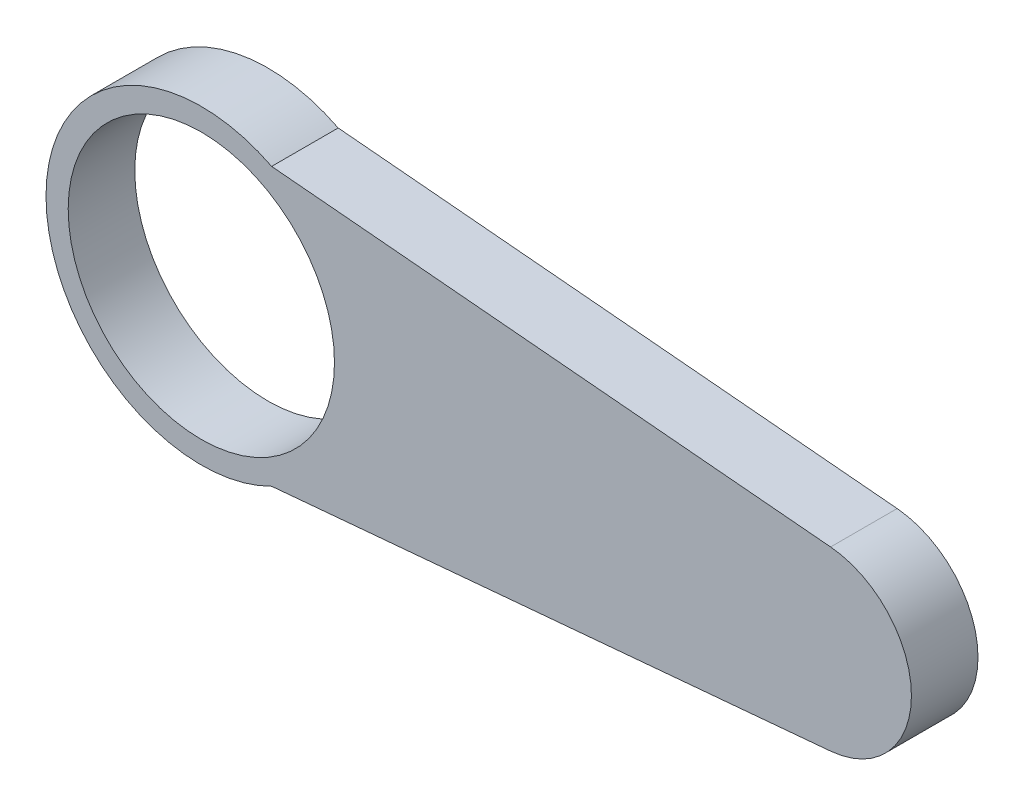
ISO-10303-21;
HEADER;
FILE_DESCRIPTION(('STEP AP214'),'2;1');
FILE_NAME('part.step','',(''),(''),'','','');
FILE_SCHEMA(('AUTOMOTIVE_DESIGN { 1 0 10303 214 1 1 1 1 }'));
ENDSEC;
DATA;
#1=APPLICATION_CONTEXT('core data for automotive mechanical design processes');
#2=APPLICATION_PROTOCOL_DEFINITION('international standard','automotive_design',2000,#1);
#3=PRODUCT_CONTEXT('',#1,'mechanical');
#4=PRODUCT('Part','Part','',(#3));
#5=PRODUCT_RELATED_PRODUCT_CATEGORY('part','',(#4));
#6=PRODUCT_DEFINITION_FORMATION('','',#4);
#7=PRODUCT_DEFINITION_CONTEXT('part definition',#1,'design');
#8=PRODUCT_DEFINITION('design','',#6,#7);
#9=PRODUCT_DEFINITION_SHAPE('','',#8);
#10=(LENGTH_UNIT() NAMED_UNIT(*) SI_UNIT(.MILLI.,.METRE.));
#11=(NAMED_UNIT(*) PLANE_ANGLE_UNIT() SI_UNIT($,.RADIAN.));
#12=(NAMED_UNIT(*) SI_UNIT($,.STERADIAN.) SOLID_ANGLE_UNIT());
#13=UNCERTAINTY_MEASURE_WITH_UNIT(LENGTH_MEASURE(1.E-05),#10,'distance_accuracy_value','');
#14=(GEOMETRIC_REPRESENTATION_CONTEXT(3) GLOBAL_UNCERTAINTY_ASSIGNED_CONTEXT((#13)) GLOBAL_UNIT_ASSIGNED_CONTEXT((#10,
#11,#12)) REPRESENTATION_CONTEXT('',''));
#15=CARTESIAN_POINT('',(0.,0.,0.));
#16=DIRECTION('',(0.,0.,1.));
#17=DIRECTION('',(1.,0.,0.));
#18=AXIS2_PLACEMENT_3D('',#15,#16,#17);
#19=CARTESIAN_POINT('',(0.,0.,1.5));
#20=DIRECTION('',(0.,0.,1.));
#21=DIRECTION('',(1.,0.,0.));
#22=AXIS2_PLACEMENT_3D('',#19,#20,#21);
#23=PLANE('',#22);
#24=CARTESIAN_POINT('',(0.,0.,1.5));
#25=DIRECTION('',(0.,0.,1.));
#26=DIRECTION('',(1.,0.,0.));
#27=AXIS2_PLACEMENT_3D('',#24,#25,#26);
#28=CIRCLE('',#27,3.5);
#29=CARTESIAN_POINT('',(1.58402839011555,3.12103413299309,1.5));
#30=VERTEX_POINT('',#29);
#31=CARTESIAN_POINT('',(1.58402839011555,-3.12103413299309,1.5));
#32=VERTEX_POINT('',#31);
#33=EDGE_CURVE('E85',#30,#32,#28,.T.);
#34=ORIENTED_EDGE('',*,*,#33,.T.);
#35=DIRECTION('',(0.996006054813167,0.0892857142857144,0.));
#36=VECTOR('',#35,1.);
#37=CARTESIAN_POINT('',(14.1785714285714,-1.99201210962634,1.5));
#38=LINE('',#37,#36);
#39=CARTESIAN_POINT('',(14.1785714285714,-1.99201210962634,1.5));
#40=VERTEX_POINT('',#39);
#41=EDGE_CURVE('E80',#32,#40,#38,.T.);
#42=ORIENTED_EDGE('',*,*,#41,.T.);
#43=CARTESIAN_POINT('',(14.,0.,1.5));
#44=DIRECTION('',(0.,0.,1.));
#45=DIRECTION('',(1.,0.,0.));
#46=AXIS2_PLACEMENT_3D('',#43,#44,#45);
#47=CIRCLE('',#46,2.);
#48=CARTESIAN_POINT('',(14.1785714285714,1.99201210962634,1.5));
#49=VERTEX_POINT('',#48);
#50=EDGE_CURVE('E83',#40,#49,#47,.T.);
#51=ORIENTED_EDGE('',*,*,#50,.T.);
#52=DIRECTION('',(-0.996006054813167,0.0892857142857142,0.));
#53=VECTOR('',#52,1.);
#54=CARTESIAN_POINT('',(1.58402839011555,3.12103413299309,1.5));
#55=LINE('',#54,#53);
#56=EDGE_CURVE('E50',#49,#30,#55,.T.);
#57=ORIENTED_EDGE('',*,*,#56,.T.);
#58=EDGE_LOOP('',(#34,#42,#51,#57));
#59=FACE_BOUND('',#58,.T.);
#60=CARTESIAN_POINT('',(0.,0.,1.5));
#61=DIRECTION('',(0.,0.,1.));
#62=DIRECTION('',(1.,0.,0.));
#63=AXIS2_PLACEMENT_3D('',#60,#61,#62);
#64=CIRCLE('',#63,3.);
#65=CARTESIAN_POINT('',(3.,0.,1.5));
#66=VERTEX_POINT('',#65);
#67=EDGE_CURVE('E100',#66,#66,#64,.T.);
#68=ORIENTED_EDGE('',*,*,#67,.F.);
#69=EDGE_LOOP('',(#68));
#70=FACE_BOUND('',#69,.T.);
#71=ADVANCED_FACE('F33',(#59,#70),#23,.T.);
#72=CARTESIAN_POINT('',(0.,0.,0.));
#73=DIRECTION('',(0.,0.,1.));
#74=DIRECTION('',(1.,0.,0.));
#75=AXIS2_PLACEMENT_3D('',#72,#73,#74);
#76=PLANE('',#75);
#77=CARTESIAN_POINT('',(0.,0.,0.));
#78=DIRECTION('',(0.,0.,1.));
#79=DIRECTION('',(1.,0.,0.));
#80=AXIS2_PLACEMENT_3D('',#77,#78,#79);
#81=CIRCLE('',#80,3.5);
#82=CARTESIAN_POINT('',(1.58402839011555,3.12103413299309,0.));
#83=VERTEX_POINT('',#82);
#84=CARTESIAN_POINT('',(1.58402839011555,-3.12103413299309,0.));
#85=VERTEX_POINT('',#84);
#86=EDGE_CURVE('E97',#83,#85,#81,.T.);
#87=ORIENTED_EDGE('',*,*,#86,.F.);
#88=DIRECTION('',(-0.996006054813167,0.0892857142857142,0.));
#89=VECTOR('',#88,1.);
#90=CARTESIAN_POINT('',(1.58402839011555,3.12103413299309,0.));
#91=LINE('',#90,#89);
#92=CARTESIAN_POINT('',(14.1785714285714,1.99201210962634,0.));
#93=VERTEX_POINT('',#92);
#94=EDGE_CURVE('E73',#93,#83,#91,.T.);
#95=ORIENTED_EDGE('',*,*,#94,.F.);
#96=CARTESIAN_POINT('',(14.,0.,0.));
#97=DIRECTION('',(0.,0.,1.));
#98=DIRECTION('',(1.,0.,0.));
#99=AXIS2_PLACEMENT_3D('',#96,#97,#98);
#100=CIRCLE('',#99,2.);
#101=CARTESIAN_POINT('',(14.1785714285714,-1.99201210962634,0.));
#102=VERTEX_POINT('',#101);
#103=EDGE_CURVE('E67',#102,#93,#100,.T.);
#104=ORIENTED_EDGE('',*,*,#103,.F.);
#105=DIRECTION('',(0.996006054813167,0.0892857142857144,0.));
#106=VECTOR('',#105,1.);
#107=CARTESIAN_POINT('',(14.1785714285714,-1.99201210962634,0.));
#108=LINE('',#107,#106);
#109=EDGE_CURVE('E89',#85,#102,#108,.T.);
#110=ORIENTED_EDGE('',*,*,#109,.F.);
#111=EDGE_LOOP('',(#87,#95,#104,#110));
#112=FACE_BOUND('',#111,.T.);
#113=CARTESIAN_POINT('',(0.,0.,0.));
#114=DIRECTION('',(0.,0.,1.));
#115=DIRECTION('',(1.,0.,0.));
#116=AXIS2_PLACEMENT_3D('',#113,#114,#115);
#117=CIRCLE('',#116,3.);
#118=CARTESIAN_POINT('',(3.,0.,0.));
#119=VERTEX_POINT('',#118);
#120=EDGE_CURVE('E112',#119,#119,#117,.T.);
#121=ORIENTED_EDGE('',*,*,#120,.T.);
#122=EDGE_LOOP('',(#121));
#123=FACE_BOUND('',#122,.T.);
#124=ADVANCED_FACE('F108',(#112,#123),#76,.F.);
#125=CARTESIAN_POINT('',(0.,0.,1.5));
#126=DIRECTION('',(0.,0.,-1.));
#127=DIRECTION('',(-1.,0.,0.));
#128=AXIS2_PLACEMENT_3D('',#125,#126,#127);
#129=CYLINDRICAL_SURFACE('',#128,3.5);
#130=ORIENTED_EDGE('',*,*,#86,.T.);
#131=DIRECTION('',(0.,0.,-1.));
#132=VECTOR('',#131,1.);
#133=CARTESIAN_POINT('',(1.58402839011555,-3.12103413299309,1.5));
#134=LINE('',#133,#132);
#135=EDGE_CURVE('E11',#32,#85,#134,.T.);
#136=ORIENTED_EDGE('',*,*,#135,.F.);
#137=ORIENTED_EDGE('',*,*,#33,.F.);
#138=DIRECTION('',(0.,0.,-1.));
#139=VECTOR('',#138,1.);
#140=CARTESIAN_POINT('',(1.58402839011555,3.12103413299309,1.5));
#141=LINE('',#140,#139);
#142=EDGE_CURVE('E93',#30,#83,#141,.T.);
#143=ORIENTED_EDGE('',*,*,#142,.T.);
#144=EDGE_LOOP('',(#130,#136,#137,#143));
#145=FACE_BOUND('',#144,.T.);
#146=ADVANCED_FACE('F35',(#145),#129,.T.);
#147=CARTESIAN_POINT('',(14.1785714285714,-1.99201210962634,1.5));
#148=DIRECTION('',(-0.0892857142857143,0.996006054813167,0.));
#149=DIRECTION('',(-0.996006054813167,-0.0892857142857144,0.));
#150=AXIS2_PLACEMENT_3D('',#147,#148,#149);
#151=PLANE('',#150);
#152=ORIENTED_EDGE('',*,*,#109,.T.);
#153=DIRECTION('',(0.,0.,-1.));
#154=VECTOR('',#153,1.);
#155=CARTESIAN_POINT('',(14.1785714285714,-1.99201210962634,1.5));
#156=LINE('',#155,#154);
#157=EDGE_CURVE('E42',#40,#102,#156,.T.);
#158=ORIENTED_EDGE('',*,*,#157,.F.);
#159=ORIENTED_EDGE('',*,*,#41,.F.);
#160=ORIENTED_EDGE('',*,*,#135,.T.);
#161=EDGE_LOOP('',(#152,#158,#159,#160));
#162=FACE_BOUND('',#161,.T.);
#163=ADVANCED_FACE('F88',(#162),#151,.F.);
#164=CARTESIAN_POINT('',(14.,0.,1.5));
#165=DIRECTION('',(0.,0.,-1.));
#166=DIRECTION('',(-1.,0.,0.));
#167=AXIS2_PLACEMENT_3D('',#164,#165,#166);
#168=CYLINDRICAL_SURFACE('',#167,2.);
#169=ORIENTED_EDGE('',*,*,#103,.T.);
#170=DIRECTION('',(0.,0.,-1.));
#171=VECTOR('',#170,1.);
#172=CARTESIAN_POINT('',(14.1785714285714,1.99201210962634,1.5));
#173=LINE('',#172,#171);
#174=EDGE_CURVE('E90',#49,#93,#173,.T.);
#175=ORIENTED_EDGE('',*,*,#174,.F.);
#176=ORIENTED_EDGE('',*,*,#50,.F.);
#177=ORIENTED_EDGE('',*,*,#157,.T.);
#178=EDGE_LOOP('',(#169,#175,#176,#177));
#179=FACE_BOUND('',#178,.T.);
#180=ADVANCED_FACE('F91',(#179),#168,.T.);
#181=CARTESIAN_POINT('',(1.58402839011555,3.12103413299309,1.5));
#182=DIRECTION('',(-0.0892857142857142,-0.996006054813167,0.));
#183=DIRECTION('',(0.996006054813167,-0.0892857142857142,0.));
#184=AXIS2_PLACEMENT_3D('',#181,#182,#183);
#185=PLANE('',#184);
#186=ORIENTED_EDGE('',*,*,#94,.T.);
#187=ORIENTED_EDGE('',*,*,#142,.F.);
#188=ORIENTED_EDGE('',*,*,#56,.F.);
#189=ORIENTED_EDGE('',*,*,#174,.T.);
#190=EDGE_LOOP('',(#186,#187,#188,#189));
#191=FACE_BOUND('',#190,.T.);
#192=ADVANCED_FACE('F105',(#191),#185,.F.);
#193=CARTESIAN_POINT('',(0.,0.,1.5));
#194=DIRECTION('',(0.,0.,-1.));
#195=DIRECTION('',(-1.,0.,0.));
#196=AXIS2_PLACEMENT_3D('',#193,#194,#195);
#197=CYLINDRICAL_SURFACE('',#196,3.);
#198=ORIENTED_EDGE('',*,*,#67,.T.);
#199=EDGE_LOOP('',(#198));
#200=FACE_BOUND('',#199,.T.);
#201=ORIENTED_EDGE('',*,*,#120,.F.);
#202=EDGE_LOOP('',(#201));
#203=FACE_BOUND('',#202,.T.);
#204=ADVANCED_FACE('F118',(#200,#203),#197,.F.);
#205=CLOSED_SHELL('',(#71,#124,#146,#163,#180,#192,#204));
#206=MANIFOLD_SOLID_BREP('B2',#205);
#207=ADVANCED_BREP_SHAPE_REPRESENTATION('',(#18,#206),#14);
#208=SHAPE_DEFINITION_REPRESENTATION(#9,#207);
ENDSEC;
END-ISO-10303-21;
